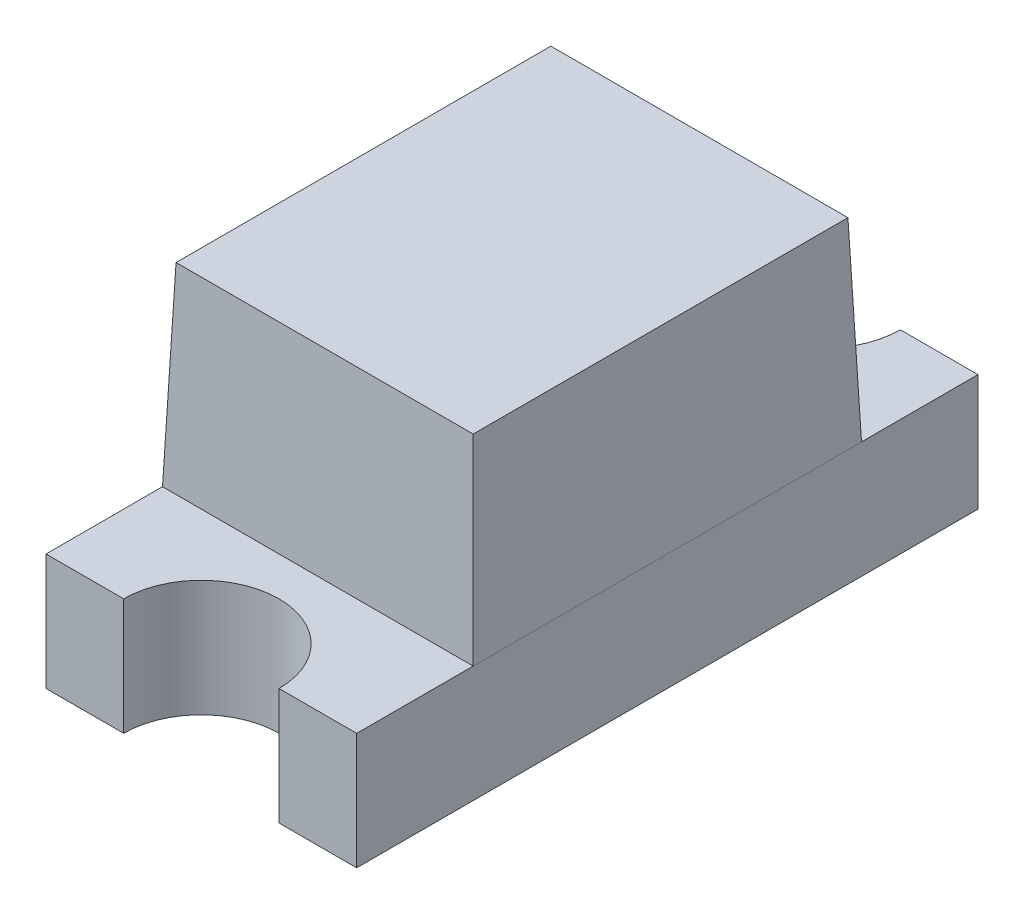
ISO-10303-21;
HEADER;
FILE_DESCRIPTION(('STEP AP214'),'2;1');
FILE_NAME('part.step','',(''),(''),'','','');
FILE_SCHEMA(('AUTOMOTIVE_DESIGN { 1 0 10303 214 1 1 1 1 }'));
ENDSEC;
DATA;
#1=APPLICATION_CONTEXT('core data for automotive mechanical design processes');
#2=APPLICATION_PROTOCOL_DEFINITION('international standard','automotive_design',2000,#1);
#3=PRODUCT_CONTEXT('',#1,'mechanical');
#4=PRODUCT('Part','Part','',(#3));
#5=PRODUCT_RELATED_PRODUCT_CATEGORY('part','',(#4));
#6=PRODUCT_DEFINITION_FORMATION('','',#4);
#7=PRODUCT_DEFINITION_CONTEXT('part definition',#1,'design');
#8=PRODUCT_DEFINITION('design','',#6,#7);
#9=PRODUCT_DEFINITION_SHAPE('','',#8);
#10=(LENGTH_UNIT() NAMED_UNIT(*) SI_UNIT(.MILLI.,.METRE.));
#11=(NAMED_UNIT(*) PLANE_ANGLE_UNIT() SI_UNIT($,.RADIAN.));
#12=(NAMED_UNIT(*) SI_UNIT($,.STERADIAN.) SOLID_ANGLE_UNIT());
#13=UNCERTAINTY_MEASURE_WITH_UNIT(LENGTH_MEASURE(1.E-05),#10,'distance_accuracy_value','');
#14=(GEOMETRIC_REPRESENTATION_CONTEXT(3) GLOBAL_UNCERTAINTY_ASSIGNED_CONTEXT((#13)) GLOBAL_UNIT_ASSIGNED_CONTEXT((#10,
#11,#12)) REPRESENTATION_CONTEXT('',''));
#15=CARTESIAN_POINT('',(0.,0.,0.));
#16=DIRECTION('',(0.,0.,1.));
#17=DIRECTION('',(1.,0.,0.));
#18=AXIS2_PLACEMENT_3D('',#15,#16,#17);
#19=CARTESIAN_POINT('',(0.4,0.3,0.));
#20=DIRECTION('',(0.,-1.,0.));
#21=DIRECTION('',(0.,0.,-1.));
#22=AXIS2_PLACEMENT_3D('',#19,#20,#21);
#23=PLANE('',#22);
#24=CARTESIAN_POINT('',(0.0924815478242635,0.3,-1.38273771051445));
#25=DIRECTION('',(0.,1.,0.));
#26=DIRECTION('',(0.,0.,1.));
#27=AXIS2_PLACEMENT_3D('',#24,#25,#26);
#28=CIRCLE('',#27,0.0499999999999999);
#29=CARTESIAN_POINT('',(0.0924815478242635,0.3,-1.33273771051445));
#30=VERTEX_POINT('',#29);
#31=EDGE_CURVE('E158',#30,#30,#28,.T.);
#32=ORIENTED_EDGE('',*,*,#31,.F.);
#33=EDGE_LOOP('',(#32));
#34=FACE_BOUND('',#33,.T.);
#35=DIRECTION('',(-1.,0.,0.));
#36=VECTOR('',#35,1.);
#37=CARTESIAN_POINT('',(0.,0.3,-1.3));
#38=LINE('',#37,#36);
#39=CARTESIAN_POINT('',(0.8,0.3,-1.3));
#40=VERTEX_POINT('',#39);
#41=CARTESIAN_POINT('',(0.,0.3,-1.3));
#42=VERTEX_POINT('',#41);
#43=EDGE_CURVE('E143',#40,#42,#38,.T.);
#44=ORIENTED_EDGE('',*,*,#43,.F.);
#45=DIRECTION('',(0.,0.,-1.));
#46=VECTOR('',#45,1.);
#47=CARTESIAN_POINT('',(0.8,0.3,0.));
#48=LINE('',#47,#46);
#49=CARTESIAN_POINT('',(0.8,0.3,-1.6));
#50=VERTEX_POINT('',#49);
#51=EDGE_CURVE('E132',#40,#50,#48,.T.);
#52=ORIENTED_EDGE('',*,*,#51,.T.);
#53=DIRECTION('',(-1.,0.,0.));
#54=VECTOR('',#53,1.);
#55=CARTESIAN_POINT('',(0.8,0.3,-1.6));
#56=LINE('',#55,#54);
#57=CARTESIAN_POINT('',(0.6,0.3,-1.6));
#58=VERTEX_POINT('',#57);
#59=EDGE_CURVE('E131',#50,#58,#56,.T.);
#60=ORIENTED_EDGE('',*,*,#59,.T.);
#61=CARTESIAN_POINT('',(0.4,0.3,-1.6));
#62=DIRECTION('',(0.,-1.,0.));
#63=DIRECTION('',(0.,0.,1.));
#64=AXIS2_PLACEMENT_3D('',#61,#62,#63);
#65=CIRCLE('',#64,0.2);
#66=CARTESIAN_POINT('',(0.2,0.3,-1.6));
#67=VERTEX_POINT('',#66);
#68=EDGE_CURVE('E250',#58,#67,#65,.T.);
#69=ORIENTED_EDGE('',*,*,#68,.T.);
#70=DIRECTION('',(-1.,0.,0.));
#71=VECTOR('',#70,1.);
#72=CARTESIAN_POINT('',(0.,0.3,-1.6));
#73=LINE('',#72,#71);
#74=CARTESIAN_POINT('',(0.,0.3,-1.6));
#75=VERTEX_POINT('',#74);
#76=EDGE_CURVE('E245',#67,#75,#73,.T.);
#77=ORIENTED_EDGE('',*,*,#76,.T.);
#78=DIRECTION('',(0.,0.,1.));
#79=VECTOR('',#78,1.);
#80=CARTESIAN_POINT('',(0.,0.3,0.));
#81=LINE('',#80,#79);
#82=EDGE_CURVE('E227',#75,#42,#81,.T.);
#83=ORIENTED_EDGE('',*,*,#82,.T.);
#84=EDGE_LOOP('',(#44,#52,#60,#69,#77,#83));
#85=FACE_BOUND('',#84,.T.);
#86=ADVANCED_FACE('F33',(#34,#85),#23,.F.);
#87=DIRECTION('',(1.,0.,0.));
#88=VECTOR('',#87,1.);
#89=CARTESIAN_POINT('',(0.,0.3,-0.3));
#90=LINE('',#89,#88);
#91=CARTESIAN_POINT('',(0.,0.3,-0.3));
#92=VERTEX_POINT('',#91);
#93=CARTESIAN_POINT('',(0.8,0.3,-0.3));
#94=VERTEX_POINT('',#93);
#95=EDGE_CURVE('E50',#92,#94,#90,.T.);
#96=ORIENTED_EDGE('',*,*,#95,.F.);
#97=CARTESIAN_POINT('',(0.,0.3,0.));
#98=VERTEX_POINT('',#97);
#99=EDGE_CURVE('E247',#92,#98,#81,.T.);
#100=ORIENTED_EDGE('',*,*,#99,.T.);
#101=DIRECTION('',(1.,0.,0.));
#102=VECTOR('',#101,1.);
#103=CARTESIAN_POINT('',(0.,0.3,0.));
#104=LINE('',#103,#102);
#105=CARTESIAN_POINT('',(0.2,0.3,0.));
#106=VERTEX_POINT('',#105);
#107=EDGE_CURVE('E194',#98,#106,#104,.T.);
#108=ORIENTED_EDGE('',*,*,#107,.T.);
#109=CARTESIAN_POINT('',(0.4,0.3,0.));
#110=DIRECTION('',(0.,-1.,0.));
#111=DIRECTION('',(0.,0.,-1.));
#112=AXIS2_PLACEMENT_3D('',#109,#110,#111);
#113=CIRCLE('',#112,0.2);
#114=CARTESIAN_POINT('',(0.6,0.3,0.));
#115=VERTEX_POINT('',#114);
#116=EDGE_CURVE('E197',#106,#115,#113,.T.);
#117=ORIENTED_EDGE('',*,*,#116,.T.);
#118=DIRECTION('',(1.,0.,0.));
#119=VECTOR('',#118,1.);
#120=CARTESIAN_POINT('',(0.8,0.3,0.));
#121=LINE('',#120,#119);
#122=CARTESIAN_POINT('',(0.8,0.3,0.));
#123=VERTEX_POINT('',#122);
#124=EDGE_CURVE('E127',#115,#123,#121,.T.);
#125=ORIENTED_EDGE('',*,*,#124,.T.);
#126=EDGE_CURVE('E123',#123,#94,#48,.T.);
#127=ORIENTED_EDGE('',*,*,#126,.T.);
#128=EDGE_LOOP('',(#96,#100,#108,#117,#125,#127));
#129=FACE_BOUND('',#128,.T.);
#130=ADVANCED_FACE('F125',(#129),#23,.F.);
#131=CARTESIAN_POINT('',(0.,0.3,0.));
#132=DIRECTION('',(0.,0.,-1.));
#133=DIRECTION('',(-1.,0.,0.));
#134=AXIS2_PLACEMENT_3D('',#131,#132,#133);
#135=PLANE('',#134);
#136=DIRECTION('',(1.,0.,0.));
#137=VECTOR('',#136,1.);
#138=CARTESIAN_POINT('',(0.,0.,0.));
#139=LINE('',#138,#137);
#140=CARTESIAN_POINT('',(0.,0.,0.));
#141=VERTEX_POINT('',#140);
#142=CARTESIAN_POINT('',(0.2,0.,0.));
#143=VERTEX_POINT('',#142);
#144=EDGE_CURVE('E191',#141,#143,#139,.T.);
#145=ORIENTED_EDGE('',*,*,#144,.T.);
#146=DIRECTION('',(0.,-1.,0.));
#147=VECTOR('',#146,1.);
#148=CARTESIAN_POINT('',(0.2,0.3,0.));
#149=LINE('',#148,#147);
#150=EDGE_CURVE('E11',#106,#143,#149,.T.);
#151=ORIENTED_EDGE('',*,*,#150,.F.);
#152=ORIENTED_EDGE('',*,*,#107,.F.);
#153=DIRECTION('',(0.,-1.,0.));
#154=VECTOR('',#153,1.);
#155=CARTESIAN_POINT('',(0.,0.3,0.));
#156=LINE('',#155,#154);
#157=EDGE_CURVE('E224',#98,#141,#156,.T.);
#158=ORIENTED_EDGE('',*,*,#157,.T.);
#159=EDGE_LOOP('',(#145,#151,#152,#158));
#160=FACE_BOUND('',#159,.T.);
#161=ADVANCED_FACE('F35',(#160),#135,.F.);
#162=CARTESIAN_POINT('',(0.4,0.3,0.));
#163=DIRECTION('',(0.,-1.,0.));
#164=DIRECTION('',(0.,0.,-1.));
#165=AXIS2_PLACEMENT_3D('',#162,#163,#164);
#166=CYLINDRICAL_SURFACE('',#165,0.2);
#167=CARTESIAN_POINT('',(0.4,0.,0.));
#168=DIRECTION('',(0.,-1.,0.));
#169=DIRECTION('',(0.,0.,-1.));
#170=AXIS2_PLACEMENT_3D('',#167,#168,#169);
#171=CIRCLE('',#170,0.2);
#172=CARTESIAN_POINT('',(0.6,0.,0.));
#173=VERTEX_POINT('',#172);
#174=EDGE_CURVE('E239',#143,#173,#171,.T.);
#175=ORIENTED_EDGE('',*,*,#174,.T.);
#176=DIRECTION('',(0.,-1.,0.));
#177=VECTOR('',#176,1.);
#178=CARTESIAN_POINT('',(0.6,0.3,0.));
#179=LINE('',#178,#177);
#180=EDGE_CURVE('E42',#115,#173,#179,.T.);
#181=ORIENTED_EDGE('',*,*,#180,.F.);
#182=ORIENTED_EDGE('',*,*,#116,.F.);
#183=ORIENTED_EDGE('',*,*,#150,.T.);
#184=EDGE_LOOP('',(#175,#181,#182,#183));
#185=FACE_BOUND('',#184,.T.);
#186=ADVANCED_FACE('F378',(#185),#166,.F.);
#187=CARTESIAN_POINT('',(0.8,0.3,0.));
#188=DIRECTION('',(0.,0.,-1.));
#189=DIRECTION('',(-1.,0.,0.));
#190=AXIS2_PLACEMENT_3D('',#187,#188,#189);
#191=PLANE('',#190);
#192=DIRECTION('',(1.,0.,0.));
#193=VECTOR('',#192,1.);
#194=CARTESIAN_POINT('',(0.8,0.,0.));
#195=LINE('',#194,#193);
#196=CARTESIAN_POINT('',(0.8,0.,0.));
#197=VERTEX_POINT('',#196);
#198=EDGE_CURVE('E237',#173,#197,#195,.T.);
#199=ORIENTED_EDGE('',*,*,#198,.T.);
#200=DIRECTION('',(0.,-1.,0.));
#201=VECTOR('',#200,1.);
#202=CARTESIAN_POINT('',(0.8,0.3,0.));
#203=LINE('',#202,#201);
#204=EDGE_CURVE('E210',#123,#197,#203,.T.);
#205=ORIENTED_EDGE('',*,*,#204,.F.);
#206=ORIENTED_EDGE('',*,*,#124,.F.);
#207=ORIENTED_EDGE('',*,*,#180,.T.);
#208=EDGE_LOOP('',(#199,#205,#206,#207));
#209=FACE_BOUND('',#208,.T.);
#210=ADVANCED_FACE('F373',(#209),#191,.F.);
#211=CARTESIAN_POINT('',(0.8,0.3,0.));
#212=DIRECTION('',(-1.,0.,0.));
#213=DIRECTION('',(0.,0.,1.));
#214=AXIS2_PLACEMENT_3D('',#211,#212,#213);
#215=PLANE('',#214);
#216=DIRECTION('',(0.,0.,-1.));
#217=VECTOR('',#216,1.);
#218=CARTESIAN_POINT('',(0.8,0.,0.));
#219=LINE('',#218,#217);
#220=CARTESIAN_POINT('',(0.8,0.,-1.6));
#221=VERTEX_POINT('',#220);
#222=EDGE_CURVE('E235',#197,#221,#219,.T.);
#223=ORIENTED_EDGE('',*,*,#222,.T.);
#224=DIRECTION('',(0.,-1.,0.));
#225=VECTOR('',#224,1.);
#226=CARTESIAN_POINT('',(0.8,0.3,-1.6));
#227=LINE('',#226,#225);
#228=EDGE_CURVE('E212',#50,#221,#227,.T.);
#229=ORIENTED_EDGE('',*,*,#228,.F.);
#230=ORIENTED_EDGE('',*,*,#51,.F.);
#231=DIRECTION('',(0.,0.,-1.));
#232=VECTOR('',#231,1.);
#233=CARTESIAN_POINT('',(0.8,0.3,-1.3));
#234=LINE('',#233,#232);
#235=EDGE_CURVE('E136',#94,#40,#234,.T.);
#236=ORIENTED_EDGE('',*,*,#235,.F.);
#237=ORIENTED_EDGE('',*,*,#126,.F.);
#238=ORIENTED_EDGE('',*,*,#204,.T.);
#239=EDGE_LOOP('',(#223,#229,#230,#236,#237,#238));
#240=FACE_BOUND('',#239,.T.);
#241=ADVANCED_FACE('F137',(#240),#215,.F.);
#242=CARTESIAN_POINT('',(0.8,0.3,-1.6));
#243=DIRECTION('',(0.,0.,1.));
#244=DIRECTION('',(1.,0.,0.));
#245=AXIS2_PLACEMENT_3D('',#242,#243,#244);
#246=PLANE('',#245);
#247=DIRECTION('',(-1.,0.,0.));
#248=VECTOR('',#247,1.);
#249=CARTESIAN_POINT('',(0.8,0.,-1.6));
#250=LINE('',#249,#248);
#251=CARTESIAN_POINT('',(0.6,0.,-1.6));
#252=VERTEX_POINT('',#251);
#253=EDGE_CURVE('E233',#221,#252,#250,.T.);
#254=ORIENTED_EDGE('',*,*,#253,.T.);
#255=DIRECTION('',(0.,-1.,0.));
#256=VECTOR('',#255,1.);
#257=CARTESIAN_POINT('',(0.6,0.3,-1.6));
#258=LINE('',#257,#256);
#259=EDGE_CURVE('E215',#58,#252,#258,.T.);
#260=ORIENTED_EDGE('',*,*,#259,.F.);
#261=ORIENTED_EDGE('',*,*,#59,.F.);
#262=ORIENTED_EDGE('',*,*,#228,.T.);
#263=EDGE_LOOP('',(#254,#260,#261,#262));
#264=FACE_BOUND('',#263,.T.);
#265=ADVANCED_FACE('F258',(#264),#246,.F.);
#266=CARTESIAN_POINT('',(0.4,0.3,-1.6));
#267=DIRECTION('',(0.,-1.,0.));
#268=DIRECTION('',(0.,0.,-1.));
#269=AXIS2_PLACEMENT_3D('',#266,#267,#268);
#270=CYLINDRICAL_SURFACE('',#269,0.2);
#271=CARTESIAN_POINT('',(0.4,0.,-1.6));
#272=DIRECTION('',(0.,-1.,0.));
#273=DIRECTION('',(0.,0.,1.));
#274=AXIS2_PLACEMENT_3D('',#271,#272,#273);
#275=CIRCLE('',#274,0.2);
#276=CARTESIAN_POINT('',(0.2,0.,-1.6));
#277=VERTEX_POINT('',#276);
#278=EDGE_CURVE('E231',#252,#277,#275,.T.);
#279=ORIENTED_EDGE('',*,*,#278,.T.);
#280=DIRECTION('',(0.,-1.,0.));
#281=VECTOR('',#280,1.);
#282=CARTESIAN_POINT('',(0.2,0.3,-1.6));
#283=LINE('',#282,#281);
#284=EDGE_CURVE('E218',#67,#277,#283,.T.);
#285=ORIENTED_EDGE('',*,*,#284,.F.);
#286=ORIENTED_EDGE('',*,*,#68,.F.);
#287=ORIENTED_EDGE('',*,*,#259,.T.);
#288=EDGE_LOOP('',(#279,#285,#286,#287));
#289=FACE_BOUND('',#288,.T.);
#290=ADVANCED_FACE('F262',(#289),#270,.F.);
#291=CARTESIAN_POINT('',(0.,0.3,-1.6));
#292=DIRECTION('',(0.,0.,1.));
#293=DIRECTION('',(1.,0.,0.));
#294=AXIS2_PLACEMENT_3D('',#291,#292,#293);
#295=PLANE('',#294);
#296=DIRECTION('',(-1.,0.,0.));
#297=VECTOR('',#296,1.);
#298=CARTESIAN_POINT('',(0.,0.,-1.6));
#299=LINE('',#298,#297);
#300=CARTESIAN_POINT('',(0.,0.,-1.6));
#301=VERTEX_POINT('',#300);
#302=EDGE_CURVE('E229',#277,#301,#299,.T.);
#303=ORIENTED_EDGE('',*,*,#302,.T.);
#304=DIRECTION('',(0.,-1.,0.));
#305=VECTOR('',#304,1.);
#306=CARTESIAN_POINT('',(0.,0.3,-1.6));
#307=LINE('',#306,#305);
#308=EDGE_CURVE('E221',#75,#301,#307,.T.);
#309=ORIENTED_EDGE('',*,*,#308,.F.);
#310=ORIENTED_EDGE('',*,*,#76,.F.);
#311=ORIENTED_EDGE('',*,*,#284,.T.);
#312=EDGE_LOOP('',(#303,#309,#310,#311));
#313=FACE_BOUND('',#312,.T.);
#314=ADVANCED_FACE('F265',(#313),#295,.F.);
#315=CARTESIAN_POINT('',(0.,0.3,0.));
#316=DIRECTION('',(1.,0.,0.));
#317=DIRECTION('',(0.,0.,-1.));
#318=AXIS2_PLACEMENT_3D('',#315,#316,#317);
#319=PLANE('',#318);
#320=DIRECTION('',(0.,0.,1.));
#321=VECTOR('',#320,1.);
#322=CARTESIAN_POINT('',(0.,0.,0.));
#323=LINE('',#322,#321);
#324=EDGE_CURVE('E198',#301,#141,#323,.T.);
#325=ORIENTED_EDGE('',*,*,#324,.T.);
#326=ORIENTED_EDGE('',*,*,#157,.F.);
#327=ORIENTED_EDGE('',*,*,#99,.F.);
#328=DIRECTION('',(0.,0.,1.));
#329=VECTOR('',#328,1.);
#330=CARTESIAN_POINT('',(0.,0.3,-1.3));
#331=LINE('',#330,#329);
#332=EDGE_CURVE('E57',#42,#92,#331,.T.);
#333=ORIENTED_EDGE('',*,*,#332,.F.);
#334=ORIENTED_EDGE('',*,*,#82,.F.);
#335=ORIENTED_EDGE('',*,*,#308,.T.);
#336=EDGE_LOOP('',(#325,#326,#327,#333,#334,#335));
#337=FACE_BOUND('',#336,.T.);
#338=ADVANCED_FACE('F267',(#337),#319,.F.);
#339=CARTESIAN_POINT('',(0.4,0.,0.));
#340=DIRECTION('',(0.,-1.,0.));
#341=DIRECTION('',(0.,0.,-1.));
#342=AXIS2_PLACEMENT_3D('',#339,#340,#341);
#343=PLANE('',#342);
#344=ORIENTED_EDGE('',*,*,#144,.F.);
#345=ORIENTED_EDGE('',*,*,#324,.F.);
#346=ORIENTED_EDGE('',*,*,#302,.F.);
#347=ORIENTED_EDGE('',*,*,#278,.F.);
#348=ORIENTED_EDGE('',*,*,#253,.F.);
#349=ORIENTED_EDGE('',*,*,#222,.F.);
#350=ORIENTED_EDGE('',*,*,#198,.F.);
#351=ORIENTED_EDGE('',*,*,#174,.F.);
#352=EDGE_LOOP('',(#344,#345,#346,#347,#348,#349,#350,#351));
#353=FACE_BOUND('',#352,.T.);
#354=ADVANCED_FACE('F269',(#353),#343,.T.);
#355=CARTESIAN_POINT('',(0.0924815478242635,0.25,-1.38273771051445));
#356=DIRECTION('',(0.,1.,0.));
#357=DIRECTION('',(0.,0.,1.));
#358=AXIS2_PLACEMENT_3D('',#355,#356,#357);
#359=CYLINDRICAL_SURFACE('',#358,0.0499999999999999);
#360=CARTESIAN_POINT('',(0.0924815478242635,0.25,-1.38273771051445));
#361=DIRECTION('',(0.,1.,0.));
#362=DIRECTION('',(0.,0.,1.));
#363=AXIS2_PLACEMENT_3D('',#360,#361,#362);
#364=CIRCLE('',#363,0.0499999999999999);
#365=CARTESIAN_POINT('',(0.0924815478242635,0.25,-1.33273771051445));
#366=VERTEX_POINT('',#365);
#367=EDGE_CURVE('E188',#366,#366,#364,.T.);
#368=ORIENTED_EDGE('',*,*,#367,.F.);
#369=EDGE_LOOP('',(#368));
#370=FACE_BOUND('',#369,.T.);
#371=ORIENTED_EDGE('',*,*,#31,.T.);
#372=EDGE_LOOP('',(#371));
#373=FACE_BOUND('',#372,.T.);
#374=ADVANCED_FACE('F275',(#370,#373),#359,.F.);
#375=CARTESIAN_POINT('',(0.0924815478242635,0.25,-1.38273771051445));
#376=DIRECTION('',(0.,1.,0.));
#377=DIRECTION('',(0.,0.,1.));
#378=AXIS2_PLACEMENT_3D('',#375,#376,#377);
#379=PLANE('',#378);
#380=ORIENTED_EDGE('',*,*,#367,.T.);
#381=EDGE_LOOP('',(#380));
#382=FACE_BOUND('',#381,.T.);
#383=ADVANCED_FACE('F289',(#382),#379,.T.);
#384=CARTESIAN_POINT('',(0.,0.3,-1.3));
#385=DIRECTION('',(-0.999390827019096,0.034899496702501,0.));
#386=DIRECTION('',(-0.034899496702501,-0.999390827019096,0.));
#387=AXIS2_PLACEMENT_3D('',#384,#385,#386);
#388=PLANE('',#387);
#389=ORIENTED_EDGE('',*,*,#332,.T.);
#390=DIRECTION('',(-0.0348782627423747,-0.998782765958718,0.0348782627423747));
#391=VECTOR('',#390,1.);
#392=CARTESIAN_POINT('',(0.,0.3,-0.3));
#393=LINE('',#392,#391);
#394=CARTESIAN_POINT('',(0.0174603847458741,0.8,-0.317460384745874));
#395=VERTEX_POINT('',#394);
#396=EDGE_CURVE('E152',#395,#92,#393,.T.);
#397=ORIENTED_EDGE('',*,*,#396,.F.);
#398=DIRECTION('',(0.,0.,-1.));
#399=VECTOR('',#398,1.);
#400=CARTESIAN_POINT('',(0.0174603847458739,0.8,-1.3));
#401=LINE('',#400,#399);
#402=CARTESIAN_POINT('',(0.0174603847458739,0.8,-1.28253961525413));
#403=VERTEX_POINT('',#402);
#404=EDGE_CURVE('E176',#403,#395,#401,.F.);
#405=ORIENTED_EDGE('',*,*,#404,.F.);
#406=DIRECTION('',(-0.0348782627423747,-0.998782765958718,-0.0348782627423747));
#407=VECTOR('',#406,1.);
#408=CARTESIAN_POINT('',(0.,0.3,-1.3));
#409=LINE('',#408,#407);
#410=EDGE_CURVE('E160',#403,#42,#409,.T.);
#411=ORIENTED_EDGE('',*,*,#410,.T.);
#412=EDGE_LOOP('',(#389,#397,#405,#411));
#413=FACE_BOUND('',#412,.T.);
#414=ADVANCED_FACE('F293',(#413),#388,.T.);
#415=CARTESIAN_POINT('',(0.,0.3,-0.3));
#416=DIRECTION('',(0.,0.034899496702501,0.999390827019096));
#417=DIRECTION('',(0.,-0.999390827019096,0.034899496702501));
#418=AXIS2_PLACEMENT_3D('',#415,#416,#417);
#419=PLANE('',#418);
#420=ORIENTED_EDGE('',*,*,#95,.T.);
#421=DIRECTION('',(0.0348782627423747,-0.998782765958718,0.0348782627423747));
#422=VECTOR('',#421,1.);
#423=CARTESIAN_POINT('',(0.798783506788074,0.334835807733664,-0.301216493211926));
#424=LINE('',#423,#422);
#425=CARTESIAN_POINT('',(0.782539615254126,0.8,-0.317460384745874));
#426=VERTEX_POINT('',#425);
#427=EDGE_CURVE('E149',#426,#94,#424,.T.);
#428=ORIENTED_EDGE('',*,*,#427,.F.);
#429=DIRECTION('',(-1.,0.,0.));
#430=VECTOR('',#429,1.);
#431=CARTESIAN_POINT('',(0.,0.8,-0.317460384745874));
#432=LINE('',#431,#430);
#433=EDGE_CURVE('E183',#395,#426,#432,.F.);
#434=ORIENTED_EDGE('',*,*,#433,.F.);
#435=ORIENTED_EDGE('',*,*,#396,.T.);
#436=EDGE_LOOP('',(#420,#428,#434,#435));
#437=FACE_BOUND('',#436,.T.);
#438=ADVANCED_FACE('F148',(#437),#419,.T.);
#439=CARTESIAN_POINT('',(0.8,0.3,-1.3));
#440=DIRECTION('',(0.999390827019096,0.034899496702501,0.));
#441=DIRECTION('',(-0.034899496702501,0.999390827019096,0.));
#442=AXIS2_PLACEMENT_3D('',#439,#440,#441);
#443=PLANE('',#442);
#444=ORIENTED_EDGE('',*,*,#235,.T.);
#445=DIRECTION('',(0.0348782627423747,-0.998782765958718,-0.0348782627423747));
#446=VECTOR('',#445,1.);
#447=CARTESIAN_POINT('',(0.799026805430459,0.327868646186931,-1.29902680543046));
#448=LINE('',#447,#446);
#449=CARTESIAN_POINT('',(0.782539615254126,0.8,-1.28253961525413));
#450=VERTEX_POINT('',#449);
#451=EDGE_CURVE('E156',#450,#40,#448,.T.);
#452=ORIENTED_EDGE('',*,*,#451,.F.);
#453=DIRECTION('',(0.,0.,1.));
#454=VECTOR('',#453,1.);
#455=CARTESIAN_POINT('',(0.782539615254126,0.8,-1.3));
#456=LINE('',#455,#454);
#457=EDGE_CURVE('E155',#426,#450,#456,.F.);
#458=ORIENTED_EDGE('',*,*,#457,.F.);
#459=ORIENTED_EDGE('',*,*,#427,.T.);
#460=EDGE_LOOP('',(#444,#452,#458,#459));
#461=FACE_BOUND('',#460,.T.);
#462=ADVANCED_FACE('F154',(#461),#443,.T.);
#463=CARTESIAN_POINT('',(0.,0.3,-1.3));
#464=DIRECTION('',(0.,0.034899496702501,-0.999390827019096));
#465=DIRECTION('',(0.,0.999390827019096,0.034899496702501));
#466=AXIS2_PLACEMENT_3D('',#463,#464,#465);
#467=PLANE('',#466);
#468=ORIENTED_EDGE('',*,*,#43,.T.);
#469=ORIENTED_EDGE('',*,*,#410,.F.);
#470=DIRECTION('',(1.,0.,0.));
#471=VECTOR('',#470,1.);
#472=CARTESIAN_POINT('',(0.,0.8,-1.28253961525413));
#473=LINE('',#472,#471);
#474=EDGE_CURVE('E186',#450,#403,#473,.F.);
#475=ORIENTED_EDGE('',*,*,#474,.F.);
#476=ORIENTED_EDGE('',*,*,#451,.T.);
#477=EDGE_LOOP('',(#468,#469,#475,#476));
#478=FACE_BOUND('',#477,.T.);
#479=ADVANCED_FACE('F299',(#478),#467,.T.);
#480=CARTESIAN_POINT('',(0.,0.8,0.));
#481=DIRECTION('',(0.,1.,0.));
#482=DIRECTION('',(0.,0.,1.));
#483=AXIS2_PLACEMENT_3D('',#480,#481,#482);
#484=PLANE('',#483);
#485=ORIENTED_EDGE('',*,*,#404,.T.);
#486=ORIENTED_EDGE('',*,*,#433,.T.);
#487=ORIENTED_EDGE('',*,*,#457,.T.);
#488=ORIENTED_EDGE('',*,*,#474,.T.);
#489=EDGE_LOOP('',(#485,#486,#487,#488));
#490=FACE_BOUND('',#489,.T.);
#491=ADVANCED_FACE('F302',(#490),#484,.T.);
#492=CLOSED_SHELL('',(#86,#130,#161,#186,#210,#241,#265,#290,#314,#338,#354,#374,#383,#414,#438,
#462,#479,#491));
#493=MANIFOLD_SOLID_BREP('B2',#492);
#494=ADVANCED_BREP_SHAPE_REPRESENTATION('',(#18,#493),#14);
#495=SHAPE_DEFINITION_REPRESENTATION(#9,#494);
ENDSEC;
END-ISO-10303-21;
